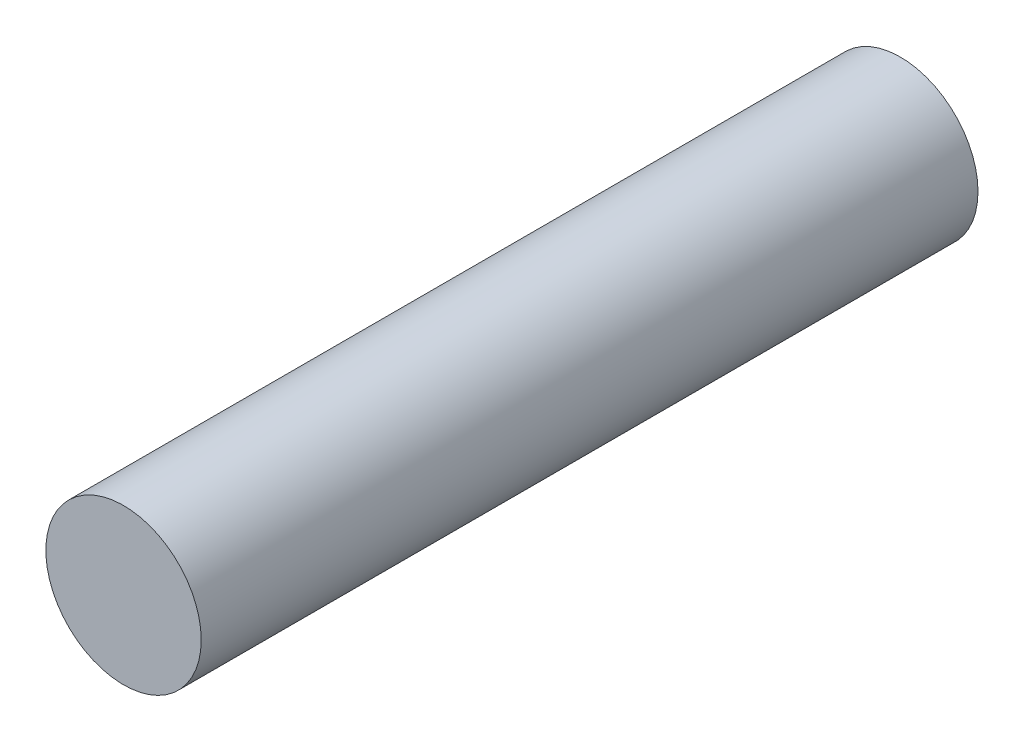
ISO-10303-21;
HEADER;
FILE_DESCRIPTION(('STEP AP214'),'2;1');
FILE_NAME('part.step','',(''),(''),'','','');
FILE_SCHEMA(('AUTOMOTIVE_DESIGN { 1 0 10303 214 1 1 1 1 }'));
ENDSEC;
DATA;
#1=APPLICATION_CONTEXT('core data for automotive mechanical design processes');
#2=APPLICATION_PROTOCOL_DEFINITION('international standard','automotive_design',2000,#1);
#3=PRODUCT_CONTEXT('',#1,'mechanical');
#4=PRODUCT('Part','Part','',(#3));
#5=PRODUCT_RELATED_PRODUCT_CATEGORY('part','',(#4));
#6=PRODUCT_DEFINITION_FORMATION('','',#4);
#7=PRODUCT_DEFINITION_CONTEXT('part definition',#1,'design');
#8=PRODUCT_DEFINITION('design','',#6,#7);
#9=PRODUCT_DEFINITION_SHAPE('','',#8);
#10=(LENGTH_UNIT() NAMED_UNIT(*) SI_UNIT(.MILLI.,.METRE.));
#11=(NAMED_UNIT(*) PLANE_ANGLE_UNIT() SI_UNIT($,.RADIAN.));
#12=(NAMED_UNIT(*) SI_UNIT($,.STERADIAN.) SOLID_ANGLE_UNIT());
#13=UNCERTAINTY_MEASURE_WITH_UNIT(LENGTH_MEASURE(1.E-05),#10,'distance_accuracy_value','');
#14=(GEOMETRIC_REPRESENTATION_CONTEXT(3) GLOBAL_UNCERTAINTY_ASSIGNED_CONTEXT((#13)) GLOBAL_UNIT_ASSIGNED_CONTEXT((#10,
#11,#12)) REPRESENTATION_CONTEXT('',''));
#15=CARTESIAN_POINT('',(0.,0.,0.));
#16=DIRECTION('',(0.,0.,1.));
#17=DIRECTION('',(1.,0.,0.));
#18=AXIS2_PLACEMENT_3D('',#15,#16,#17);
#19=CARTESIAN_POINT('',(0.,0.,30.));
#20=DIRECTION('',(0.,0.,-1.));
#21=DIRECTION('',(-1.,0.,0.));
#22=AXIS2_PLACEMENT_3D('',#19,#20,#21);
#23=CYLINDRICAL_SURFACE('',#22,6.);
#24=CARTESIAN_POINT('',(0.,0.,30.));
#25=DIRECTION('',(0.,0.,1.));
#26=DIRECTION('',(1.,0.,0.));
#27=AXIS2_PLACEMENT_3D('',#24,#25,#26);
#28=CIRCLE('',#27,6.);
#29=CARTESIAN_POINT('',(6.,0.,30.));
#30=VERTEX_POINT('',#29);
#31=EDGE_CURVE('E10',#30,#30,#28,.T.);
#32=ORIENTED_EDGE('',*,*,#31,.F.);
#33=EDGE_LOOP('',(#32));
#34=FACE_BOUND('',#33,.T.);
#35=CARTESIAN_POINT('',(0.,0.,-30.));
#36=DIRECTION('',(0.,0.,1.));
#37=DIRECTION('',(1.,0.,0.));
#38=AXIS2_PLACEMENT_3D('',#35,#36,#37);
#39=CIRCLE('',#38,6.);
#40=CARTESIAN_POINT('',(6.,0.,-30.));
#41=VERTEX_POINT('',#40);
#42=EDGE_CURVE('E40',#41,#41,#39,.T.);
#43=ORIENTED_EDGE('',*,*,#42,.T.);
#44=EDGE_LOOP('',(#43));
#45=FACE_BOUND('',#44,.T.);
#46=ADVANCED_FACE('F37',(#34,#45),#23,.T.);
#47=CARTESIAN_POINT('',(0.,0.,30.));
#48=DIRECTION('',(0.,0.,1.));
#49=DIRECTION('',(1.,0.,0.));
#50=AXIS2_PLACEMENT_3D('',#47,#48,#49);
#51=PLANE('',#50);
#52=ORIENTED_EDGE('',*,*,#31,.T.);
#53=EDGE_LOOP('',(#52));
#54=FACE_BOUND('',#53,.T.);
#55=ADVANCED_FACE('F52',(#54),#51,.T.);
#56=CARTESIAN_POINT('',(0.,0.,-30.));
#57=DIRECTION('',(0.,0.,1.));
#58=DIRECTION('',(1.,0.,0.));
#59=AXIS2_PLACEMENT_3D('',#56,#57,#58);
#60=PLANE('',#59);
#61=ORIENTED_EDGE('',*,*,#42,.F.);
#62=EDGE_LOOP('',(#61));
#63=FACE_BOUND('',#62,.T.);
#64=ADVANCED_FACE('F50',(#63),#60,.F.);
#65=CLOSED_SHELL('',(#46,#55,#64));
#66=MANIFOLD_SOLID_BREP('B2',#65);
#67=ADVANCED_BREP_SHAPE_REPRESENTATION('',(#18,#66),#14);
#68=SHAPE_DEFINITION_REPRESENTATION(#9,#67);
ENDSEC;
END-ISO-10303-21;
